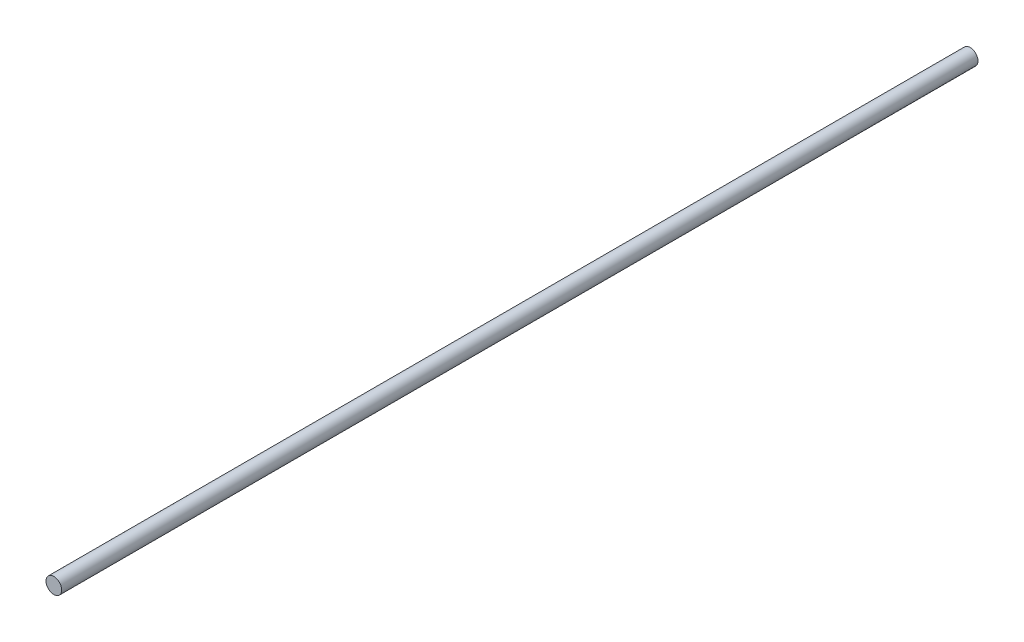
ISO-10303-21;
HEADER;
FILE_DESCRIPTION(('STEP AP214'),'2;1');
FILE_NAME('part.step','',(''),(''),'','','');
FILE_SCHEMA(('AUTOMOTIVE_DESIGN { 1 0 10303 214 1 1 1 1 }'));
ENDSEC;
DATA;
#1=APPLICATION_CONTEXT('core data for automotive mechanical design processes');
#2=APPLICATION_PROTOCOL_DEFINITION('international standard','automotive_design',2000,#1);
#3=PRODUCT_CONTEXT('',#1,'mechanical');
#4=PRODUCT('Part','Part','',(#3));
#5=PRODUCT_RELATED_PRODUCT_CATEGORY('part','',(#4));
#6=PRODUCT_DEFINITION_FORMATION('','',#4);
#7=PRODUCT_DEFINITION_CONTEXT('part definition',#1,'design');
#8=PRODUCT_DEFINITION('design','',#6,#7);
#9=PRODUCT_DEFINITION_SHAPE('','',#8);
#10=(LENGTH_UNIT() NAMED_UNIT(*) SI_UNIT(.MILLI.,.METRE.));
#11=(NAMED_UNIT(*) PLANE_ANGLE_UNIT() SI_UNIT($,.RADIAN.));
#12=(NAMED_UNIT(*) SI_UNIT($,.STERADIAN.) SOLID_ANGLE_UNIT());
#13=UNCERTAINTY_MEASURE_WITH_UNIT(LENGTH_MEASURE(1.E-05),#10,'distance_accuracy_value','');
#14=(GEOMETRIC_REPRESENTATION_CONTEXT(3) GLOBAL_UNCERTAINTY_ASSIGNED_CONTEXT((#13)) GLOBAL_UNIT_ASSIGNED_CONTEXT((#10,
#11,#12)) REPRESENTATION_CONTEXT('',''));
#15=CARTESIAN_POINT('',(0.,0.,0.));
#16=DIRECTION('',(0.,0.,1.));
#17=DIRECTION('',(1.,0.,0.));
#18=AXIS2_PLACEMENT_3D('',#15,#16,#17);
#19=CARTESIAN_POINT('',(0.,0.,350.));
#20=DIRECTION('',(0.,0.,-1.));
#21=DIRECTION('',(-1.,0.,0.));
#22=AXIS2_PLACEMENT_3D('',#19,#20,#21);
#23=CYLINDRICAL_SURFACE('',#22,3.);
#24=CARTESIAN_POINT('',(0.,0.,350.));
#25=DIRECTION('',(0.,0.,1.));
#26=DIRECTION('',(1.,0.,0.));
#27=AXIS2_PLACEMENT_3D('',#24,#25,#26);
#28=CIRCLE('',#27,3.);
#29=CARTESIAN_POINT('',(3.,0.,350.));
#30=VERTEX_POINT('',#29);
#31=EDGE_CURVE('E10',#30,#30,#28,.T.);
#32=ORIENTED_EDGE('',*,*,#31,.F.);
#33=EDGE_LOOP('',(#32));
#34=FACE_BOUND('',#33,.T.);
#35=CARTESIAN_POINT('',(0.,0.,0.));
#36=DIRECTION('',(0.,0.,1.));
#37=DIRECTION('',(1.,0.,0.));
#38=AXIS2_PLACEMENT_3D('',#35,#36,#37);
#39=CIRCLE('',#38,3.);
#40=CARTESIAN_POINT('',(3.,0.,0.));
#41=VERTEX_POINT('',#40);
#42=EDGE_CURVE('E40',#41,#41,#39,.T.);
#43=ORIENTED_EDGE('',*,*,#42,.T.);
#44=EDGE_LOOP('',(#43));
#45=FACE_BOUND('',#44,.T.);
#46=ADVANCED_FACE('F37',(#34,#45),#23,.T.);
#47=CARTESIAN_POINT('',(0.,0.,350.));
#48=DIRECTION('',(0.,0.,1.));
#49=DIRECTION('',(1.,0.,0.));
#50=AXIS2_PLACEMENT_3D('',#47,#48,#49);
#51=PLANE('',#50);
#52=ORIENTED_EDGE('',*,*,#31,.T.);
#53=EDGE_LOOP('',(#52));
#54=FACE_BOUND('',#53,.T.);
#55=ADVANCED_FACE('F54',(#54),#51,.T.);
#56=CARTESIAN_POINT('',(0.,0.,0.));
#57=DIRECTION('',(0.,0.,1.));
#58=DIRECTION('',(1.,0.,0.));
#59=AXIS2_PLACEMENT_3D('',#56,#57,#58);
#60=PLANE('',#59);
#61=ORIENTED_EDGE('',*,*,#42,.F.);
#62=EDGE_LOOP('',(#61));
#63=FACE_BOUND('',#62,.T.);
#64=ADVANCED_FACE('F52',(#63),#60,.F.);
#65=CLOSED_SHELL('',(#46,#55,#64));
#66=MANIFOLD_SOLID_BREP('B2',#65);
#67=ADVANCED_BREP_SHAPE_REPRESENTATION('',(#18,#66),#14);
#68=SHAPE_DEFINITION_REPRESENTATION(#9,#67);
ENDSEC;
END-ISO-10303-21;
